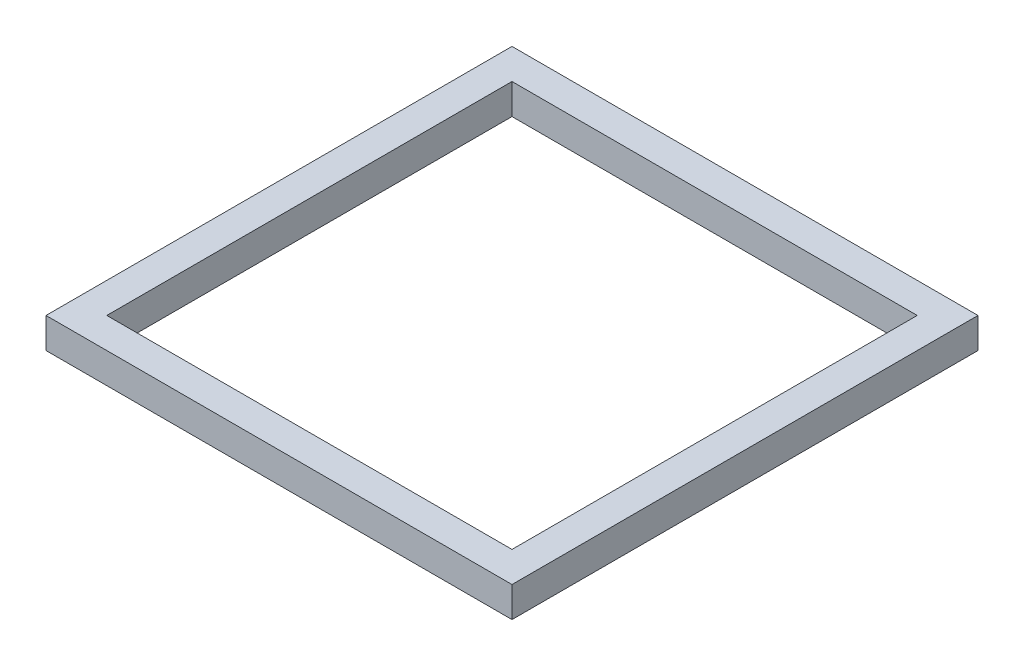
ISO-10303-21;
HEADER;
FILE_DESCRIPTION(('STEP AP214'),'2;1');
FILE_NAME('part.step','',(''),(''),'','','');
FILE_SCHEMA(('AUTOMOTIVE_DESIGN { 1 0 10303 214 1 1 1 1 }'));
ENDSEC;
DATA;
#1=APPLICATION_CONTEXT('core data for automotive mechanical design processes');
#2=APPLICATION_PROTOCOL_DEFINITION('international standard','automotive_design',2000,#1);
#3=PRODUCT_CONTEXT('',#1,'mechanical');
#4=PRODUCT('Part','Part','',(#3));
#5=PRODUCT_RELATED_PRODUCT_CATEGORY('part','',(#4));
#6=PRODUCT_DEFINITION_FORMATION('','',#4);
#7=PRODUCT_DEFINITION_CONTEXT('part definition',#1,'design');
#8=PRODUCT_DEFINITION('design','',#6,#7);
#9=PRODUCT_DEFINITION_SHAPE('','',#8);
#10=(LENGTH_UNIT() NAMED_UNIT(*) SI_UNIT(.MILLI.,.METRE.));
#11=(NAMED_UNIT(*) PLANE_ANGLE_UNIT() SI_UNIT($,.RADIAN.));
#12=(NAMED_UNIT(*) SI_UNIT($,.STERADIAN.) SOLID_ANGLE_UNIT());
#13=UNCERTAINTY_MEASURE_WITH_UNIT(LENGTH_MEASURE(1.E-05),#10,'distance_accuracy_value','');
#14=(GEOMETRIC_REPRESENTATION_CONTEXT(3) GLOBAL_UNCERTAINTY_ASSIGNED_CONTEXT((#13)) GLOBAL_UNIT_ASSIGNED_CONTEXT((#10,
#11,#12)) REPRESENTATION_CONTEXT('',''));
#15=CARTESIAN_POINT('',(0.,0.,0.));
#16=DIRECTION('',(0.,0.,1.));
#17=DIRECTION('',(1.,0.,0.));
#18=AXIS2_PLACEMENT_3D('',#15,#16,#17);
#19=CARTESIAN_POINT('',(0.,15.,0.));
#20=DIRECTION('',(0.,1.,0.));
#21=DIRECTION('',(0.,0.,1.));
#22=AXIS2_PLACEMENT_3D('',#19,#20,#21);
#23=PLANE('',#22);
#24=DIRECTION('',(0.,0.,-1.));
#25=VECTOR('',#24,1.);
#26=CARTESIAN_POINT('',(115.,15.,-115.));
#27=LINE('',#26,#25);
#28=CARTESIAN_POINT('',(115.,15.,115.));
#29=VERTEX_POINT('',#28);
#30=CARTESIAN_POINT('',(115.,15.,-115.));
#31=VERTEX_POINT('',#30);
#32=EDGE_CURVE('E138',#29,#31,#27,.T.);
#33=ORIENTED_EDGE('',*,*,#32,.T.);
#34=DIRECTION('',(-1.,0.,0.));
#35=VECTOR('',#34,1.);
#36=CARTESIAN_POINT('',(-115.,15.,-115.));
#37=LINE('',#36,#35);
#38=CARTESIAN_POINT('',(-115.,15.,-115.));
#39=VERTEX_POINT('',#38);
#40=EDGE_CURVE('E141',#31,#39,#37,.T.);
#41=ORIENTED_EDGE('',*,*,#40,.T.);
#42=DIRECTION('',(0.,0.,1.));
#43=VECTOR('',#42,1.);
#44=CARTESIAN_POINT('',(-115.,15.,-115.));
#45=LINE('',#44,#43);
#46=CARTESIAN_POINT('',(-115.,15.,115.));
#47=VERTEX_POINT('',#46);
#48=EDGE_CURVE('E144',#39,#47,#45,.T.);
#49=ORIENTED_EDGE('',*,*,#48,.T.);
#50=DIRECTION('',(1.,0.,0.));
#51=VECTOR('',#50,1.);
#52=CARTESIAN_POINT('',(-115.,15.,115.));
#53=LINE('',#52,#51);
#54=EDGE_CURVE('E146',#47,#29,#53,.T.);
#55=ORIENTED_EDGE('',*,*,#54,.T.);
#56=EDGE_LOOP('',(#33,#41,#49,#55));
#57=FACE_BOUND('',#56,.T.);
#58=DIRECTION('',(-1.,0.,0.));
#59=VECTOR('',#58,1.);
#60=CARTESIAN_POINT('',(-100.,15.,-100.));
#61=LINE('',#60,#59);
#62=CARTESIAN_POINT('',(100.,15.,-100.));
#63=VERTEX_POINT('',#62);
#64=CARTESIAN_POINT('',(-100.,15.,-100.));
#65=VERTEX_POINT('',#64);
#66=EDGE_CURVE('E110',#63,#65,#61,.T.);
#67=ORIENTED_EDGE('',*,*,#66,.F.);
#68=DIRECTION('',(0.,0.,-1.));
#69=VECTOR('',#68,1.);
#70=CARTESIAN_POINT('',(100.,15.,-100.));
#71=LINE('',#70,#69);
#72=CARTESIAN_POINT('',(100.,15.,100.));
#73=VERTEX_POINT('',#72);
#74=EDGE_CURVE('E102',#73,#63,#71,.T.);
#75=ORIENTED_EDGE('',*,*,#74,.F.);
#76=DIRECTION('',(1.,0.,0.));
#77=VECTOR('',#76,1.);
#78=CARTESIAN_POINT('',(-100.,15.,100.));
#79=LINE('',#78,#77);
#80=CARTESIAN_POINT('',(-100.,15.,100.));
#81=VERTEX_POINT('',#80);
#82=EDGE_CURVE('E124',#81,#73,#79,.T.);
#83=ORIENTED_EDGE('',*,*,#82,.F.);
#84=DIRECTION('',(0.,0.,1.));
#85=VECTOR('',#84,1.);
#86=CARTESIAN_POINT('',(-100.,15.,-100.));
#87=LINE('',#86,#85);
#88=EDGE_CURVE('E122',#65,#81,#87,.T.);
#89=ORIENTED_EDGE('',*,*,#88,.F.);
#90=EDGE_LOOP('',(#67,#75,#83,#89));
#91=FACE_BOUND('',#90,.T.);
#92=ADVANCED_FACE('F37',(#57,#91),#23,.T.);
#93=CARTESIAN_POINT('',(0.,0.,0.));
#94=DIRECTION('',(0.,1.,0.));
#95=DIRECTION('',(0.,0.,1.));
#96=AXIS2_PLACEMENT_3D('',#93,#94,#95);
#97=PLANE('',#96);
#98=DIRECTION('',(0.,0.,-1.));
#99=VECTOR('',#98,1.);
#100=CARTESIAN_POINT('',(115.,0.,-115.));
#101=LINE('',#100,#99);
#102=CARTESIAN_POINT('',(115.,0.,115.));
#103=VERTEX_POINT('',#102);
#104=CARTESIAN_POINT('',(115.,0.,-115.));
#105=VERTEX_POINT('',#104);
#106=EDGE_CURVE('E118',#103,#105,#101,.T.);
#107=ORIENTED_EDGE('',*,*,#106,.F.);
#108=DIRECTION('',(1.,0.,0.));
#109=VECTOR('',#108,1.);
#110=CARTESIAN_POINT('',(-115.,0.,115.));
#111=LINE('',#110,#109);
#112=CARTESIAN_POINT('',(-115.,0.,115.));
#113=VERTEX_POINT('',#112);
#114=EDGE_CURVE('E142',#113,#103,#111,.T.);
#115=ORIENTED_EDGE('',*,*,#114,.F.);
#116=DIRECTION('',(0.,0.,1.));
#117=VECTOR('',#116,1.);
#118=CARTESIAN_POINT('',(-115.,0.,-115.));
#119=LINE('',#118,#117);
#120=CARTESIAN_POINT('',(-115.,0.,-115.));
#121=VERTEX_POINT('',#120);
#122=EDGE_CURVE('E153',#121,#113,#119,.T.);
#123=ORIENTED_EDGE('',*,*,#122,.F.);
#124=DIRECTION('',(-1.,0.,0.));
#125=VECTOR('',#124,1.);
#126=CARTESIAN_POINT('',(-115.,0.,-115.));
#127=LINE('',#126,#125);
#128=EDGE_CURVE('E151',#105,#121,#127,.T.);
#129=ORIENTED_EDGE('',*,*,#128,.F.);
#130=EDGE_LOOP('',(#107,#115,#123,#129));
#131=FACE_BOUND('',#130,.T.);
#132=DIRECTION('',(0.,0.,-1.));
#133=VECTOR('',#132,1.);
#134=CARTESIAN_POINT('',(100.,0.,-100.));
#135=LINE('',#134,#133);
#136=CARTESIAN_POINT('',(100.,0.,100.));
#137=VERTEX_POINT('',#136);
#138=CARTESIAN_POINT('',(100.,0.,-100.));
#139=VERTEX_POINT('',#138);
#140=EDGE_CURVE('E60',#137,#139,#135,.T.);
#141=ORIENTED_EDGE('',*,*,#140,.T.);
#142=DIRECTION('',(-1.,0.,0.));
#143=VECTOR('',#142,1.);
#144=CARTESIAN_POINT('',(-100.,0.,-100.));
#145=LINE('',#144,#143);
#146=CARTESIAN_POINT('',(-100.,0.,-100.));
#147=VERTEX_POINT('',#146);
#148=EDGE_CURVE('E117',#139,#147,#145,.T.);
#149=ORIENTED_EDGE('',*,*,#148,.T.);
#150=DIRECTION('',(0.,0.,1.));
#151=VECTOR('',#150,1.);
#152=CARTESIAN_POINT('',(-100.,0.,-100.));
#153=LINE('',#152,#151);
#154=CARTESIAN_POINT('',(-100.,0.,100.));
#155=VERTEX_POINT('',#154);
#156=EDGE_CURVE('E130',#147,#155,#153,.T.);
#157=ORIENTED_EDGE('',*,*,#156,.T.);
#158=DIRECTION('',(1.,0.,0.));
#159=VECTOR('',#158,1.);
#160=CARTESIAN_POINT('',(-100.,0.,100.));
#161=LINE('',#160,#159);
#162=EDGE_CURVE('E111',#155,#137,#161,.T.);
#163=ORIENTED_EDGE('',*,*,#162,.T.);
#164=EDGE_LOOP('',(#141,#149,#157,#163));
#165=FACE_BOUND('',#164,.T.);
#166=ADVANCED_FACE('F171',(#131,#165),#97,.F.);
#167=CARTESIAN_POINT('',(115.,15.,-115.));
#168=DIRECTION('',(-1.,0.,0.));
#169=DIRECTION('',(0.,0.,1.));
#170=AXIS2_PLACEMENT_3D('',#167,#168,#169);
#171=PLANE('',#170);
#172=ORIENTED_EDGE('',*,*,#106,.T.);
#173=DIRECTION('',(0.,-1.,0.));
#174=VECTOR('',#173,1.);
#175=CARTESIAN_POINT('',(115.,15.,-115.));
#176=LINE('',#175,#174);
#177=EDGE_CURVE('E11',#31,#105,#176,.T.);
#178=ORIENTED_EDGE('',*,*,#177,.F.);
#179=ORIENTED_EDGE('',*,*,#32,.F.);
#180=DIRECTION('',(0.,-1.,0.));
#181=VECTOR('',#180,1.);
#182=CARTESIAN_POINT('',(115.,15.,115.));
#183=LINE('',#182,#181);
#184=EDGE_CURVE('E148',#29,#103,#183,.T.);
#185=ORIENTED_EDGE('',*,*,#184,.T.);
#186=EDGE_LOOP('',(#172,#178,#179,#185));
#187=FACE_BOUND('',#186,.T.);
#188=ADVANCED_FACE('F39',(#187),#171,.F.);
#189=CARTESIAN_POINT('',(-115.,15.,-115.));
#190=DIRECTION('',(0.,0.,1.));
#191=DIRECTION('',(1.,0.,0.));
#192=AXIS2_PLACEMENT_3D('',#189,#190,#191);
#193=PLANE('',#192);
#194=ORIENTED_EDGE('',*,*,#128,.T.);
#195=DIRECTION('',(0.,-1.,0.));
#196=VECTOR('',#195,1.);
#197=CARTESIAN_POINT('',(-115.,15.,-115.));
#198=LINE('',#197,#196);
#199=EDGE_CURVE('E45',#39,#121,#198,.T.);
#200=ORIENTED_EDGE('',*,*,#199,.F.);
#201=ORIENTED_EDGE('',*,*,#40,.F.);
#202=ORIENTED_EDGE('',*,*,#177,.T.);
#203=EDGE_LOOP('',(#194,#200,#201,#202));
#204=FACE_BOUND('',#203,.T.);
#205=ADVANCED_FACE('F181',(#204),#193,.F.);
#206=CARTESIAN_POINT('',(-115.,15.,-115.));
#207=DIRECTION('',(1.,0.,0.));
#208=DIRECTION('',(0.,0.,-1.));
#209=AXIS2_PLACEMENT_3D('',#206,#207,#208);
#210=PLANE('',#209);
#211=ORIENTED_EDGE('',*,*,#122,.T.);
#212=DIRECTION('',(0.,-1.,0.));
#213=VECTOR('',#212,1.);
#214=CARTESIAN_POINT('',(-115.,15.,115.));
#215=LINE('',#214,#213);
#216=EDGE_CURVE('E158',#47,#113,#215,.T.);
#217=ORIENTED_EDGE('',*,*,#216,.F.);
#218=ORIENTED_EDGE('',*,*,#48,.F.);
#219=ORIENTED_EDGE('',*,*,#199,.T.);
#220=EDGE_LOOP('',(#211,#217,#218,#219));
#221=FACE_BOUND('',#220,.T.);
#222=ADVANCED_FACE('F165',(#221),#210,.F.);
#223=CARTESIAN_POINT('',(-115.,15.,115.));
#224=DIRECTION('',(0.,0.,-1.));
#225=DIRECTION('',(-1.,0.,0.));
#226=AXIS2_PLACEMENT_3D('',#223,#224,#225);
#227=PLANE('',#226);
#228=ORIENTED_EDGE('',*,*,#114,.T.);
#229=ORIENTED_EDGE('',*,*,#184,.F.);
#230=ORIENTED_EDGE('',*,*,#54,.F.);
#231=ORIENTED_EDGE('',*,*,#216,.T.);
#232=EDGE_LOOP('',(#228,#229,#230,#231));
#233=FACE_BOUND('',#232,.T.);
#234=ADVANCED_FACE('F175',(#233),#227,.F.);
#235=CARTESIAN_POINT('',(100.,15.,-100.));
#236=DIRECTION('',(-1.,0.,0.));
#237=DIRECTION('',(0.,0.,1.));
#238=AXIS2_PLACEMENT_3D('',#235,#236,#237);
#239=PLANE('',#238);
#240=ORIENTED_EDGE('',*,*,#140,.F.);
#241=DIRECTION('',(0.,-1.,0.));
#242=VECTOR('',#241,1.);
#243=CARTESIAN_POINT('',(100.,15.,100.));
#244=LINE('',#243,#242);
#245=EDGE_CURVE('E106',#73,#137,#244,.T.);
#246=ORIENTED_EDGE('',*,*,#245,.F.);
#247=ORIENTED_EDGE('',*,*,#74,.T.);
#248=DIRECTION('',(0.,-1.,0.));
#249=VECTOR('',#248,1.);
#250=CARTESIAN_POINT('',(100.,15.,-100.));
#251=LINE('',#250,#249);
#252=EDGE_CURVE('E105',#63,#139,#251,.T.);
#253=ORIENTED_EDGE('',*,*,#252,.T.);
#254=EDGE_LOOP('',(#240,#246,#247,#253));
#255=FACE_BOUND('',#254,.T.);
#256=ADVANCED_FACE('F104',(#255),#239,.T.);
#257=CARTESIAN_POINT('',(-100.,15.,-100.));
#258=DIRECTION('',(0.,0.,1.));
#259=DIRECTION('',(1.,0.,0.));
#260=AXIS2_PLACEMENT_3D('',#257,#258,#259);
#261=PLANE('',#260);
#262=ORIENTED_EDGE('',*,*,#148,.F.);
#263=ORIENTED_EDGE('',*,*,#252,.F.);
#264=ORIENTED_EDGE('',*,*,#66,.T.);
#265=DIRECTION('',(0.,-1.,0.));
#266=VECTOR('',#265,1.);
#267=CARTESIAN_POINT('',(-100.,15.,-100.));
#268=LINE('',#267,#266);
#269=EDGE_CURVE('E119',#65,#147,#268,.T.);
#270=ORIENTED_EDGE('',*,*,#269,.T.);
#271=EDGE_LOOP('',(#262,#263,#264,#270));
#272=FACE_BOUND('',#271,.T.);
#273=ADVANCED_FACE('F114',(#272),#261,.T.);
#274=CARTESIAN_POINT('',(-100.,15.,-100.));
#275=DIRECTION('',(1.,0.,0.));
#276=DIRECTION('',(0.,0.,-1.));
#277=AXIS2_PLACEMENT_3D('',#274,#275,#276);
#278=PLANE('',#277);
#279=ORIENTED_EDGE('',*,*,#156,.F.);
#280=ORIENTED_EDGE('',*,*,#269,.F.);
#281=ORIENTED_EDGE('',*,*,#88,.T.);
#282=DIRECTION('',(0.,-1.,0.));
#283=VECTOR('',#282,1.);
#284=CARTESIAN_POINT('',(-100.,15.,100.));
#285=LINE('',#284,#283);
#286=EDGE_CURVE('E52',#81,#155,#285,.T.);
#287=ORIENTED_EDGE('',*,*,#286,.T.);
#288=EDGE_LOOP('',(#279,#280,#281,#287));
#289=FACE_BOUND('',#288,.T.);
#290=ADVANCED_FACE('F204',(#289),#278,.T.);
#291=CARTESIAN_POINT('',(-100.,15.,100.));
#292=DIRECTION('',(0.,0.,-1.));
#293=DIRECTION('',(-1.,0.,0.));
#294=AXIS2_PLACEMENT_3D('',#291,#292,#293);
#295=PLANE('',#294);
#296=ORIENTED_EDGE('',*,*,#162,.F.);
#297=ORIENTED_EDGE('',*,*,#286,.F.);
#298=ORIENTED_EDGE('',*,*,#82,.T.);
#299=ORIENTED_EDGE('',*,*,#245,.T.);
#300=EDGE_LOOP('',(#296,#297,#298,#299));
#301=FACE_BOUND('',#300,.T.);
#302=ADVANCED_FACE('F208',(#301),#295,.T.);
#303=CLOSED_SHELL('',(#92,#166,#188,#205,#222,#234,#256,#273,#290,#302));
#304=MANIFOLD_SOLID_BREP('B2',#303);
#305=ADVANCED_BREP_SHAPE_REPRESENTATION('',(#18,#304),#14);
#306=SHAPE_DEFINITION_REPRESENTATION(#9,#305);
ENDSEC;
END-ISO-10303-21;
